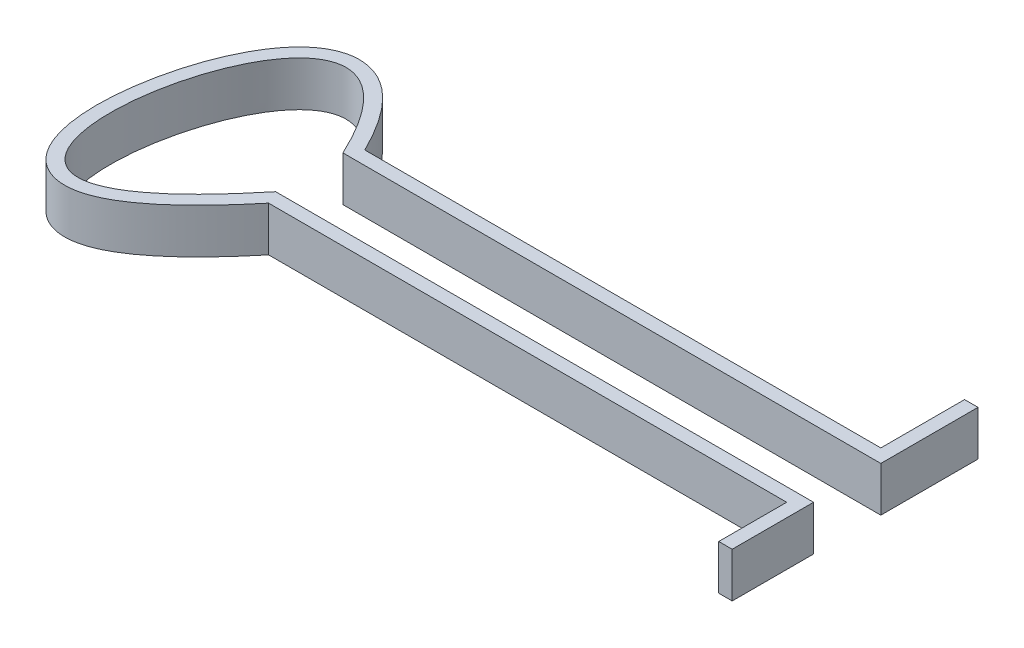
ISO-10303-21;
HEADER;
FILE_DESCRIPTION(('STEP AP214'),'2;1');
FILE_NAME('part.step','',(''),(''),'','','');
FILE_SCHEMA(('AUTOMOTIVE_DESIGN { 1 0 10303 214 1 1 1 1 }'));
ENDSEC;
DATA;
#1=APPLICATION_CONTEXT('core data for automotive mechanical design processes');
#2=APPLICATION_PROTOCOL_DEFINITION('international standard','automotive_design',2000,#1);
#3=PRODUCT_CONTEXT('',#1,'mechanical');
#4=PRODUCT('Part','Part','',(#3));
#5=PRODUCT_RELATED_PRODUCT_CATEGORY('part','',(#4));
#6=PRODUCT_DEFINITION_FORMATION('','',#4);
#7=PRODUCT_DEFINITION_CONTEXT('part definition',#1,'design');
#8=PRODUCT_DEFINITION('design','',#6,#7);
#9=PRODUCT_DEFINITION_SHAPE('','',#8);
#10=(LENGTH_UNIT() NAMED_UNIT(*) SI_UNIT(.MILLI.,.METRE.));
#11=(NAMED_UNIT(*) PLANE_ANGLE_UNIT() SI_UNIT($,.RADIAN.));
#12=(NAMED_UNIT(*) SI_UNIT($,.STERADIAN.) SOLID_ANGLE_UNIT());
#13=UNCERTAINTY_MEASURE_WITH_UNIT(LENGTH_MEASURE(1.E-05),#10,'distance_accuracy_value','');
#14=(GEOMETRIC_REPRESENTATION_CONTEXT(3) GLOBAL_UNCERTAINTY_ASSIGNED_CONTEXT((#13)) GLOBAL_UNIT_ASSIGNED_CONTEXT((#10,
#11,#12)) REPRESENTATION_CONTEXT('',''));
#15=CARTESIAN_POINT('',(0.,0.,0.));
#16=DIRECTION('',(0.,0.,1.));
#17=DIRECTION('',(1.,0.,0.));
#18=AXIS2_PLACEMENT_3D('',#15,#16,#17);
#19=CARTESIAN_POINT('',(12.,1.,0.75));
#20=DIRECTION('',(1.,0.,0.));
#21=DIRECTION('',(0.,0.,-1.));
#22=AXIS2_PLACEMENT_3D('',#19,#20,#21);
#23=PLANE('',#22);
#24=DIRECTION('',(0.,0.,1.));
#25=VECTOR('',#24,1.);
#26=CARTESIAN_POINT('',(12.,0.,0.75));
#27=LINE('',#26,#25);
#28=CARTESIAN_POINT('',(12.,0.,0.75));
#29=VERTEX_POINT('',#28);
#30=CARTESIAN_POINT('',(12.,0.,2.56575674506485));
#31=VERTEX_POINT('',#30);
#32=EDGE_CURVE('E344',#29,#31,#27,.T.);
#33=ORIENTED_EDGE('',*,*,#32,.F.);
#34=DIRECTION('',(0.,-1.,0.));
#35=VECTOR('',#34,1.);
#36=CARTESIAN_POINT('',(12.,1.,0.75));
#37=LINE('',#36,#35);
#38=CARTESIAN_POINT('',(12.,1.,0.75));
#39=VERTEX_POINT('',#38);
#40=EDGE_CURVE('E204',#39,#29,#37,.T.);
#41=ORIENTED_EDGE('',*,*,#40,.F.);
#42=DIRECTION('',(0.,0.,1.));
#43=VECTOR('',#42,1.);
#44=CARTESIAN_POINT('',(12.,1.,0.75));
#45=LINE('',#44,#43);
#46=CARTESIAN_POINT('',(12.,1.,2.56575674506485));
#47=VERTEX_POINT('',#46);
#48=EDGE_CURVE('E341',#39,#47,#45,.T.);
#49=ORIENTED_EDGE('',*,*,#48,.T.);
#50=DIRECTION('',(0.,-1.,0.));
#51=VECTOR('',#50,1.);
#52=CARTESIAN_POINT('',(12.,1.,2.56575674506485));
#53=LINE('',#52,#51);
#54=EDGE_CURVE('E224',#47,#31,#53,.T.);
#55=ORIENTED_EDGE('',*,*,#54,.T.);
#56=EDGE_LOOP('',(#33,#41,#49,#55));
#57=FACE_BOUND('',#56,.T.);
#58=ADVANCED_FACE('F127',(#57),#23,.T.);
#59=CARTESIAN_POINT('',(12.,1.,0.75));
#60=DIRECTION('',(0.,0.,-1.));
#61=DIRECTION('',(-1.,0.,0.));
#62=AXIS2_PLACEMENT_3D('',#59,#60,#61);
#63=PLANE('',#62);
#64=ORIENTED_EDGE('',*,*,#40,.T.);
#65=DIRECTION('',(1.,0.,0.));
#66=VECTOR('',#65,1.);
#67=CARTESIAN_POINT('',(12.,0.,0.75));
#68=LINE('',#67,#66);
#69=CARTESIAN_POINT('',(0.,0.,0.750000000000001));
#70=VERTEX_POINT('',#69);
#71=EDGE_CURVE('E372',#70,#29,#68,.T.);
#72=ORIENTED_EDGE('',*,*,#71,.F.);
#73=DIRECTION('',(0.,-1.,0.));
#74=VECTOR('',#73,1.);
#75=CARTESIAN_POINT('',(0.,1.,0.750000000000001));
#76=LINE('',#75,#74);
#77=CARTESIAN_POINT('',(0.,1.,0.750000000000001));
#78=VERTEX_POINT('',#77);
#79=EDGE_CURVE('E206',#78,#70,#76,.T.);
#80=ORIENTED_EDGE('',*,*,#79,.F.);
#81=DIRECTION('',(1.,0.,0.));
#82=VECTOR('',#81,1.);
#83=CARTESIAN_POINT('',(12.,1.,0.75));
#84=LINE('',#83,#82);
#85=EDGE_CURVE('E282',#78,#39,#84,.T.);
#86=ORIENTED_EDGE('',*,*,#85,.T.);
#87=EDGE_LOOP('',(#64,#72,#80,#86));
#88=FACE_BOUND('',#87,.T.);
#89=ADVANCED_FACE('F248',(#88),#63,.T.);
#90=CARTESIAN_POINT('',(12.,1.,-1.05));
#91=DIRECTION('',(1.,0.,0.));
#92=DIRECTION('',(0.,0.,-1.));
#93=AXIS2_PLACEMENT_3D('',#90,#91,#92);
#94=PLANE('',#93);
#95=DIRECTION('',(0.,0.,1.));
#96=VECTOR('',#95,1.);
#97=CARTESIAN_POINT('',(12.,0.,-1.05));
#98=LINE('',#97,#96);
#99=CARTESIAN_POINT('',(12.,0.,-2.91798327591554));
#100=VERTEX_POINT('',#99);
#101=CARTESIAN_POINT('',(12.,0.,-0.75));
#102=VERTEX_POINT('',#101);
#103=EDGE_CURVE('E174',#100,#102,#98,.T.);
#104=ORIENTED_EDGE('',*,*,#103,.F.);
#105=DIRECTION('',(0.,-1.,0.));
#106=VECTOR('',#105,1.);
#107=CARTESIAN_POINT('',(12.,1.,-2.91798327591554));
#108=LINE('',#107,#106);
#109=CARTESIAN_POINT('',(12.,1.,-2.91798327591554));
#110=VERTEX_POINT('',#109);
#111=EDGE_CURVE('E186',#110,#100,#108,.T.);
#112=ORIENTED_EDGE('',*,*,#111,.F.);
#113=DIRECTION('',(0.,0.,1.));
#114=VECTOR('',#113,1.);
#115=CARTESIAN_POINT('',(12.,1.,-1.05));
#116=LINE('',#115,#114);
#117=CARTESIAN_POINT('',(12.,1.,-0.75));
#118=VERTEX_POINT('',#117);
#119=EDGE_CURVE('E239',#110,#118,#116,.T.);
#120=ORIENTED_EDGE('',*,*,#119,.T.);
#121=DIRECTION('',(0.,-1.,0.));
#122=VECTOR('',#121,1.);
#123=CARTESIAN_POINT('',(12.,1.,-0.75));
#124=LINE('',#123,#122);
#125=EDGE_CURVE('E365',#118,#102,#124,.T.);
#126=ORIENTED_EDGE('',*,*,#125,.T.);
#127=EDGE_LOOP('',(#104,#112,#120,#126));
#128=FACE_BOUND('',#127,.T.);
#129=ADVANCED_FACE('F246',(#128),#94,.T.);
#130=CARTESIAN_POINT('',(-3.29763770808291,0.,0.195296987080229));
#131=DIRECTION('',(0.,-1.,0.));
#132=DIRECTION('',(-1.,0.,0.));
#133=AXIS2_PLACEMENT_3D('',#130,#131,#132);
#134=PLANE('',#133);
#135=DIRECTION('',(-1.,0.,0.));
#136=VECTOR('',#135,1.);
#137=CARTESIAN_POINT('',(12.,0.,-0.75));
#138=LINE('',#137,#136);
#139=CARTESIAN_POINT('',(0.,0.,-0.749999999999998));
#140=VERTEX_POINT('',#139);
#141=EDGE_CURVE('E369',#102,#140,#138,.T.);
#142=ORIENTED_EDGE('',*,*,#141,.T.);
#143=CARTESIAN_POINT('',(0.,0.,-0.749999999999998));
#144=CARTESIAN_POINT('',(-3.05460844596616,0.,-7.29435552246422));
#145=CARTESIAN_POINT('',(-5.7390921089216,0.,7.8151474880115));
#146=CARTESIAN_POINT('',(0.,0.,0.750000000000002));
#147=B_SPLINE_CURVE_WITH_KNOTS('',3,(#143,#144,#145,#146),.UNSPECIFIED.,.F.,.F.,(4,4),(0.,1.),.UNSPECIFIED.);
#148=EDGE_CURVE('E371',#140,#70,#147,.T.);
#149=ORIENTED_EDGE('',*,*,#148,.T.);
#150=ORIENTED_EDGE('',*,*,#71,.T.);
#151=ORIENTED_EDGE('',*,*,#32,.T.);
#152=DIRECTION('',(-1.,0.,0.));
#153=VECTOR('',#152,1.);
#154=CARTESIAN_POINT('',(12.,0.,2.56575674506485));
#155=LINE('',#154,#153);
#156=CARTESIAN_POINT('',(11.7,0.,2.56575674506485));
#157=VERTEX_POINT('',#156);
#158=EDGE_CURVE('E221',#31,#157,#155,.T.);
#159=ORIENTED_EDGE('',*,*,#158,.T.);
#160=DIRECTION('',(0.,0.,-1.));
#161=VECTOR('',#160,1.);
#162=CARTESIAN_POINT('',(11.7,0.,0.75));
#163=LINE('',#162,#161);
#164=CARTESIAN_POINT('',(11.7,0.,1.05));
#165=VERTEX_POINT('',#164);
#166=EDGE_CURVE('E203',#165,#157,#163,.F.);
#167=ORIENTED_EDGE('',*,*,#166,.F.);
#168=DIRECTION('',(1.,0.,0.));
#169=VECTOR('',#168,1.);
#170=CARTESIAN_POINT('',(12.,0.,1.05));
#171=LINE('',#170,#169);
#172=CARTESIAN_POINT('',(0.142017656530043,0.,1.04999999999997));
#173=VERTEX_POINT('',#172);
#174=EDGE_CURVE('E232',#173,#165,#171,.T.);
#175=ORIENTED_EDGE('',*,*,#174,.F.);
#176=CARTESIAN_POINT('',(0.188737475079369,0.,-1.05000000000077));
#177=CARTESIAN_POINT('',(-0.00623066673862435,0.,-1.44461604351487));
#178=CARTESIAN_POINT('',(-0.202103872039046,0.,-1.76167528713868));
#179=CARTESIAN_POINT('',(-0.60236215558205,0.,-2.26332472992038));
#180=CARTESIAN_POINT('',(-0.807283235955483,0.,-2.44915938356683));
#181=CARTESIAN_POINT('',(-1.24142046827214,0.,-2.69437696458514));
#182=CARTESIAN_POINT('',(-1.47399203384513,0.,-2.75025148541265));
#183=CARTESIAN_POINT('',(-1.92028355521816,0.,-2.71631693914565));
#184=CARTESIAN_POINT('',(-2.12691637498861,0.,-2.6293469032868));
#185=CARTESIAN_POINT('',(-2.48527279219832,0.,-2.37602083643426));
#186=CARTESIAN_POINT('',(-2.64064828562096,0.,-2.21007439700882));
#187=CARTESIAN_POINT('',(-2.91770848233255,0.,-1.8273598342353));
#188=CARTESIAN_POINT('',(-3.03935843837088,0.,-1.60982191209649));
#189=CARTESIAN_POINT('',(-3.35926486031367,0.,-0.905300073656018));
#190=CARTESIAN_POINT('',(-3.51276228452031,0.,-0.366014687713816));
#191=CARTESIAN_POINT('',(-3.68222369762933,0.,0.707176031667566));
#192=CARTESIAN_POINT('',(-3.69903125556612,0.,1.23962594320525));
#193=CARTESIAN_POINT('',(-3.5857844192635,0.,1.93485051873964));
#194=CARTESIAN_POINT('',(-3.52500054761445,0.,2.15006099245367));
#195=CARTESIAN_POINT('',(-3.33584078625393,0.,2.53241391109929));
#196=CARTESIAN_POINT('',(-3.20476320664506,0.,2.7022580715191));
#197=CARTESIAN_POINT('',(-2.93671411077461,0.,2.87860771400436));
#198=CARTESIAN_POINT('',(-2.8360854383937,0.,2.92322612199284));
#199=CARTESIAN_POINT('',(-2.62140154361181,0.,2.97605919707439));
#200=CARTESIAN_POINT('',(-2.5078645461521,0.,2.98435928446106));
#201=CARTESIAN_POINT('',(-2.16023093745061,0.,2.95752231485432));
#202=CARTESIAN_POINT('',(-1.92022991221463,0.,2.87347299463238));
#203=CARTESIAN_POINT('',(-1.40887574123493,0.,2.58509703873658));
#204=CARTESIAN_POINT('',(-1.13582602291264,0.,2.37936130223542));
#205=CARTESIAN_POINT('',(-0.537724241790539,0.,1.82660916978087));
#206=CARTESIAN_POINT('',(-0.212917804275779,0.,1.47926367418651));
#207=CARTESIAN_POINT('',(0.142017656530047,0.,1.04999999999997));
#208=B_SPLINE_CURVE_WITH_KNOTS('',3,(#176,#177,#178,#179,#180,#181,#182,#183,#184,#185,#186,
#187,#188,#189,#190,#191,#192,#193,#194,#195,#196,#197,#198,#199,#200,#201,#202,#203,#204,#205,
#206,#207),.UNSPECIFIED.,.F.,.F.,(4,2,2,2,2,2,2,2,2,2,2,2,2,2,2,4),(0.,0.0624999999999999,0.125,
0.1875,0.25,0.3125,0.375,0.5,0.625,0.6875,0.75,0.78125,0.8125,0.875,0.9375,1.),.UNSPECIFIED.);
#209=CARTESIAN_POINT('',(0.188737475079369,0.,-1.05000000000077));
#210=VERTEX_POINT('',#209);
#211=EDGE_CURVE('E348',#210,#173,#208,.T.);
#212=ORIENTED_EDGE('',*,*,#211,.F.);
#213=DIRECTION('',(-1.,0.,0.));
#214=VECTOR('',#213,1.);
#215=CARTESIAN_POINT('',(12.,0.,-1.05));
#216=LINE('',#215,#214);
#217=CARTESIAN_POINT('',(11.7,0.,-1.05));
#218=VERTEX_POINT('',#217);
#219=EDGE_CURVE('E196',#218,#210,#216,.T.);
#220=ORIENTED_EDGE('',*,*,#219,.F.);
#221=DIRECTION('',(0.,0.,-1.));
#222=VECTOR('',#221,1.);
#223=CARTESIAN_POINT('',(11.7,0.,-2.91798327591554));
#224=LINE('',#223,#222);
#225=CARTESIAN_POINT('',(11.7,0.,-2.91798327591554));
#226=VERTEX_POINT('',#225);
#227=EDGE_CURVE('E179',#226,#218,#224,.F.);
#228=ORIENTED_EDGE('',*,*,#227,.F.);
#229=DIRECTION('',(1.,0.,0.));
#230=VECTOR('',#229,1.);
#231=CARTESIAN_POINT('',(11.7,0.,-2.91798327591554));
#232=LINE('',#231,#230);
#233=EDGE_CURVE('E193',#226,#100,#232,.T.);
#234=ORIENTED_EDGE('',*,*,#233,.T.);
#235=ORIENTED_EDGE('',*,*,#103,.T.);
#236=EDGE_LOOP('',(#142,#149,#150,#151,#159,#167,#175,#212,#220,#228,#234,#235));
#237=FACE_BOUND('',#236,.T.);
#238=ADVANCED_FACE('F192',(#237),#134,.T.);
#239=CARTESIAN_POINT('',(-3.29763770808291,1.,0.195296987080229));
#240=DIRECTION('',(0.,-1.,0.));
#241=DIRECTION('',(-1.,0.,0.));
#242=AXIS2_PLACEMENT_3D('',#239,#240,#241);
#243=PLANE('',#242);
#244=ORIENTED_EDGE('',*,*,#119,.F.);
#245=DIRECTION('',(1.,0.,0.));
#246=VECTOR('',#245,1.);
#247=CARTESIAN_POINT('',(11.7,1.,-2.91798327591554));
#248=LINE('',#247,#246);
#249=CARTESIAN_POINT('',(11.7,1.,-2.91798327591554));
#250=VERTEX_POINT('',#249);
#251=EDGE_CURVE('E187',#250,#110,#248,.T.);
#252=ORIENTED_EDGE('',*,*,#251,.F.);
#253=DIRECTION('',(0.,0.,-1.));
#254=VECTOR('',#253,1.);
#255=CARTESIAN_POINT('',(11.7,1.,-2.91798327591554));
#256=LINE('',#255,#254);
#257=CARTESIAN_POINT('',(11.7,1.,-1.05));
#258=VERTEX_POINT('',#257);
#259=EDGE_CURVE('E181',#250,#258,#256,.F.);
#260=ORIENTED_EDGE('',*,*,#259,.T.);
#261=DIRECTION('',(-1.,0.,0.));
#262=VECTOR('',#261,1.);
#263=CARTESIAN_POINT('',(12.,1.,-1.05));
#264=LINE('',#263,#262);
#265=CARTESIAN_POINT('',(0.188737475079369,1.,-1.05000000000077));
#266=VERTEX_POINT('',#265);
#267=EDGE_CURVE('E244',#258,#266,#264,.T.);
#268=ORIENTED_EDGE('',*,*,#267,.T.);
#269=CARTESIAN_POINT('',(0.188737475079369,1.,-1.05000000000077));
#270=CARTESIAN_POINT('',(-0.00623066673862435,1.,-1.44461604351487));
#271=CARTESIAN_POINT('',(-0.202103872039046,1.,-1.76167528713868));
#272=CARTESIAN_POINT('',(-0.60236215558205,1.,-2.26332472992038));
#273=CARTESIAN_POINT('',(-0.807283235955483,1.,-2.44915938356683));
#274=CARTESIAN_POINT('',(-1.24142046827214,1.,-2.69437696458514));
#275=CARTESIAN_POINT('',(-1.47399203384513,1.,-2.75025148541265));
#276=CARTESIAN_POINT('',(-1.92028355521816,1.,-2.71631693914565));
#277=CARTESIAN_POINT('',(-2.12691637498861,1.,-2.6293469032868));
#278=CARTESIAN_POINT('',(-2.48527279219832,1.,-2.37602083643426));
#279=CARTESIAN_POINT('',(-2.64064828562096,1.,-2.21007439700882));
#280=CARTESIAN_POINT('',(-2.91770848233255,1.,-1.8273598342353));
#281=CARTESIAN_POINT('',(-3.03935843837088,1.,-1.60982191209649));
#282=CARTESIAN_POINT('',(-3.35926486031367,1.,-0.905300073656018));
#283=CARTESIAN_POINT('',(-3.51276228452031,1.,-0.366014687713816));
#284=CARTESIAN_POINT('',(-3.68222369762933,1.,0.707176031667566));
#285=CARTESIAN_POINT('',(-3.69903125556612,1.,1.23962594320525));
#286=CARTESIAN_POINT('',(-3.5857844192635,1.,1.93485051873964));
#287=CARTESIAN_POINT('',(-3.52500054761445,1.,2.15006099245367));
#288=CARTESIAN_POINT('',(-3.33584078625393,1.,2.53241391109929));
#289=CARTESIAN_POINT('',(-3.20476320664506,1.,2.7022580715191));
#290=CARTESIAN_POINT('',(-2.93671411077461,1.,2.87860771400436));
#291=CARTESIAN_POINT('',(-2.8360854383937,1.,2.92322612199284));
#292=CARTESIAN_POINT('',(-2.62140154361181,1.,2.97605919707439));
#293=CARTESIAN_POINT('',(-2.5078645461521,1.,2.98435928446106));
#294=CARTESIAN_POINT('',(-2.16023093745061,1.,2.95752231485432));
#295=CARTESIAN_POINT('',(-1.92022991221463,1.,2.87347299463238));
#296=CARTESIAN_POINT('',(-1.40887574123493,1.,2.58509703873658));
#297=CARTESIAN_POINT('',(-1.13582602291264,1.,2.37936130223542));
#298=CARTESIAN_POINT('',(-0.537724241790539,1.,1.82660916978087));
#299=CARTESIAN_POINT('',(-0.212917804275779,1.,1.47926367418651));
#300=CARTESIAN_POINT('',(0.142017656530047,1.,1.04999999999997));
#301=B_SPLINE_CURVE_WITH_KNOTS('',3,(#269,#270,#271,#272,#273,#274,#275,#276,#277,#278,#279,
#280,#281,#282,#283,#284,#285,#286,#287,#288,#289,#290,#291,#292,#293,#294,#295,#296,#297,#298,
#299,#300),.UNSPECIFIED.,.F.,.F.,(4,2,2,2,2,2,2,2,2,2,2,2,2,2,2,4),(0.,0.0624999999999999,0.125,
0.1875,0.25,0.3125,0.375,0.5,0.625,0.6875,0.75,0.78125,0.8125,0.875,0.9375,1.),.UNSPECIFIED.);
#302=CARTESIAN_POINT('',(0.142017656530043,1.,1.04999999999997));
#303=VERTEX_POINT('',#302);
#304=EDGE_CURVE('E289',#266,#303,#301,.T.);
#305=ORIENTED_EDGE('',*,*,#304,.T.);
#306=DIRECTION('',(1.,0.,0.));
#307=VECTOR('',#306,1.);
#308=CARTESIAN_POINT('',(12.,1.,1.05));
#309=LINE('',#308,#307);
#310=CARTESIAN_POINT('',(11.7,1.,1.05));
#311=VERTEX_POINT('',#310);
#312=EDGE_CURVE('E346',#303,#311,#309,.T.);
#313=ORIENTED_EDGE('',*,*,#312,.T.);
#314=DIRECTION('',(0.,0.,-1.));
#315=VECTOR('',#314,1.);
#316=CARTESIAN_POINT('',(11.7,1.,0.75));
#317=LINE('',#316,#315);
#318=CARTESIAN_POINT('',(11.7,1.,2.56575674506485));
#319=VERTEX_POINT('',#318);
#320=EDGE_CURVE('E218',#311,#319,#317,.F.);
#321=ORIENTED_EDGE('',*,*,#320,.T.);
#322=DIRECTION('',(-1.,0.,0.));
#323=VECTOR('',#322,1.);
#324=CARTESIAN_POINT('',(12.,1.,2.56575674506485));
#325=LINE('',#324,#323);
#326=EDGE_CURVE('E220',#47,#319,#325,.T.);
#327=ORIENTED_EDGE('',*,*,#326,.F.);
#328=ORIENTED_EDGE('',*,*,#48,.F.);
#329=ORIENTED_EDGE('',*,*,#85,.F.);
#330=CARTESIAN_POINT('',(0.,1.,-0.749999999999998));
#331=CARTESIAN_POINT('',(-3.05460844596616,1.,-7.29435552246422));
#332=CARTESIAN_POINT('',(-5.7390921089216,1.,7.8151474880115));
#333=CARTESIAN_POINT('',(0.,1.,0.750000000000002));
#334=B_SPLINE_CURVE_WITH_KNOTS('',3,(#330,#331,#332,#333),.UNSPECIFIED.,.F.,.F.,(4,4),(0.,1.),.UNSPECIFIED.);
#335=CARTESIAN_POINT('',(0.,1.,-0.749999999999998));
#336=VERTEX_POINT('',#335);
#337=EDGE_CURVE('E275',#336,#78,#334,.T.);
#338=ORIENTED_EDGE('',*,*,#337,.F.);
#339=DIRECTION('',(-1.,0.,0.));
#340=VECTOR('',#339,1.);
#341=CARTESIAN_POINT('',(12.,1.,-0.75));
#342=LINE('',#341,#340);
#343=EDGE_CURVE('E243',#118,#336,#342,.T.);
#344=ORIENTED_EDGE('',*,*,#343,.F.);
#345=EDGE_LOOP('',(#244,#252,#260,#268,#305,#313,#321,#327,#328,#329,#338,#344));
#346=FACE_BOUND('',#345,.T.);
#347=ADVANCED_FACE('F234',(#346),#243,.F.);
#348=DIRECTION('',(0.,-1.,0.));
#349=VECTOR('',#348,1.);
#350=SURFACE_OF_LINEAR_EXTRUSION('',#334,#349);
#351=ORIENTED_EDGE('',*,*,#148,.F.);
#352=DIRECTION('',(0.,-1.,0.));
#353=VECTOR('',#352,1.);
#354=CARTESIAN_POINT('',(0.,1.,-0.749999999999998));
#355=LINE('',#354,#353);
#356=EDGE_CURVE('E214',#336,#140,#355,.T.);
#357=ORIENTED_EDGE('',*,*,#356,.F.);
#358=ORIENTED_EDGE('',*,*,#337,.T.);
#359=ORIENTED_EDGE('',*,*,#79,.T.);
#360=EDGE_LOOP('',(#351,#357,#358,#359));
#361=FACE_BOUND('',#360,.T.);
#362=ADVANCED_FACE('F250',(#361),#350,.T.);
#363=CARTESIAN_POINT('',(12.,1.,-0.75));
#364=DIRECTION('',(0.,0.,1.));
#365=DIRECTION('',(1.,0.,0.));
#366=AXIS2_PLACEMENT_3D('',#363,#364,#365);
#367=PLANE('',#366);
#368=ORIENTED_EDGE('',*,*,#356,.T.);
#369=ORIENTED_EDGE('',*,*,#141,.F.);
#370=ORIENTED_EDGE('',*,*,#125,.F.);
#371=ORIENTED_EDGE('',*,*,#343,.T.);
#372=EDGE_LOOP('',(#368,#369,#370,#371));
#373=FACE_BOUND('',#372,.T.);
#374=ADVANCED_FACE('F261',(#373),#367,.T.);
#375=CARTESIAN_POINT('',(12.,1.,-1.05));
#376=DIRECTION('',(0.,0.,1.));
#377=DIRECTION('',(1.,0.,0.));
#378=AXIS2_PLACEMENT_3D('',#375,#376,#377);
#379=PLANE('',#378);
#380=DIRECTION('',(0.,1.,0.));
#381=VECTOR('',#380,1.);
#382=CARTESIAN_POINT('',(11.7,1.,-1.05));
#383=LINE('',#382,#381);
#384=EDGE_CURVE('E136',#218,#258,#383,.T.);
#385=ORIENTED_EDGE('',*,*,#384,.F.);
#386=ORIENTED_EDGE('',*,*,#219,.T.);
#387=DIRECTION('',(0.,-1.,0.));
#388=VECTOR('',#387,1.);
#389=CARTESIAN_POINT('',(0.188737475079369,1.,-1.05000000000077));
#390=LINE('',#389,#388);
#391=EDGE_CURVE('E363',#266,#210,#390,.T.);
#392=ORIENTED_EDGE('',*,*,#391,.F.);
#393=ORIENTED_EDGE('',*,*,#267,.F.);
#394=EDGE_LOOP('',(#385,#386,#392,#393));
#395=FACE_BOUND('',#394,.T.);
#396=ADVANCED_FACE('F268',(#395),#379,.F.);
#397=DIRECTION('',(0.,-1.,0.));
#398=VECTOR('',#397,1.);
#399=SURFACE_OF_LINEAR_EXTRUSION('',#301,#398);
#400=ORIENTED_EDGE('',*,*,#211,.T.);
#401=DIRECTION('',(0.,-1.,0.));
#402=VECTOR('',#401,1.);
#403=CARTESIAN_POINT('',(0.142017656530043,1.,1.04999999999997));
#404=LINE('',#403,#402);
#405=EDGE_CURVE('E295',#303,#173,#404,.T.);
#406=ORIENTED_EDGE('',*,*,#405,.F.);
#407=ORIENTED_EDGE('',*,*,#304,.F.);
#408=ORIENTED_EDGE('',*,*,#391,.T.);
#409=EDGE_LOOP('',(#400,#406,#407,#408));
#410=FACE_BOUND('',#409,.T.);
#411=ADVANCED_FACE('F301',(#410),#399,.F.);
#412=CARTESIAN_POINT('',(12.,1.,1.05));
#413=DIRECTION('',(0.,0.,-1.));
#414=DIRECTION('',(-1.,0.,0.));
#415=AXIS2_PLACEMENT_3D('',#412,#413,#414);
#416=PLANE('',#415);
#417=DIRECTION('',(0.,-1.,0.));
#418=VECTOR('',#417,1.);
#419=CARTESIAN_POINT('',(11.7,1.,1.05));
#420=LINE('',#419,#418);
#421=EDGE_CURVE('E12',#311,#165,#420,.T.);
#422=ORIENTED_EDGE('',*,*,#421,.F.);
#423=ORIENTED_EDGE('',*,*,#312,.F.);
#424=ORIENTED_EDGE('',*,*,#405,.T.);
#425=ORIENTED_EDGE('',*,*,#174,.T.);
#426=EDGE_LOOP('',(#422,#423,#424,#425));
#427=FACE_BOUND('',#426,.T.);
#428=ADVANCED_FACE('F303',(#427),#416,.F.);
#429=CARTESIAN_POINT('',(11.7,1.,-2.91798327591554));
#430=DIRECTION('',(0.,0.,-1.));
#431=DIRECTION('',(-1.,0.,0.));
#432=AXIS2_PLACEMENT_3D('',#429,#430,#431);
#433=PLANE('',#432);
#434=ORIENTED_EDGE('',*,*,#233,.F.);
#435=DIRECTION('',(0.,-1.,0.));
#436=VECTOR('',#435,1.);
#437=CARTESIAN_POINT('',(11.7,1.,-2.91798327591554));
#438=LINE('',#437,#436);
#439=EDGE_CURVE('E177',#250,#226,#438,.T.);
#440=ORIENTED_EDGE('',*,*,#439,.F.);
#441=ORIENTED_EDGE('',*,*,#251,.T.);
#442=ORIENTED_EDGE('',*,*,#111,.T.);
#443=EDGE_LOOP('',(#434,#440,#441,#442));
#444=FACE_BOUND('',#443,.T.);
#445=ADVANCED_FACE('F198',(#444),#433,.T.);
#446=CARTESIAN_POINT('',(11.7,1.,-2.91798327591554));
#447=DIRECTION('',(1.,0.,0.));
#448=DIRECTION('',(0.,0.,-1.));
#449=AXIS2_PLACEMENT_3D('',#446,#447,#448);
#450=PLANE('',#449);
#451=ORIENTED_EDGE('',*,*,#227,.T.);
#452=ORIENTED_EDGE('',*,*,#384,.T.);
#453=ORIENTED_EDGE('',*,*,#259,.F.);
#454=ORIENTED_EDGE('',*,*,#439,.T.);
#455=EDGE_LOOP('',(#451,#452,#453,#454));
#456=FACE_BOUND('',#455,.T.);
#457=ADVANCED_FACE('F129',(#456),#450,.F.);
#458=CARTESIAN_POINT('',(12.,1.,2.56575674506485));
#459=DIRECTION('',(0.,0.,1.));
#460=DIRECTION('',(1.,0.,0.));
#461=AXIS2_PLACEMENT_3D('',#458,#459,#460);
#462=PLANE('',#461);
#463=ORIENTED_EDGE('',*,*,#158,.F.);
#464=ORIENTED_EDGE('',*,*,#54,.F.);
#465=ORIENTED_EDGE('',*,*,#326,.T.);
#466=DIRECTION('',(0.,-1.,0.));
#467=VECTOR('',#466,1.);
#468=CARTESIAN_POINT('',(11.7,1.,2.56575674506485));
#469=LINE('',#468,#467);
#470=EDGE_CURVE('E230',#319,#157,#469,.T.);
#471=ORIENTED_EDGE('',*,*,#470,.T.);
#472=EDGE_LOOP('',(#463,#464,#465,#471));
#473=FACE_BOUND('',#472,.T.);
#474=ADVANCED_FACE('F257',(#473),#462,.T.);
#475=CARTESIAN_POINT('',(11.7,1.,0.75));
#476=DIRECTION('',(1.,0.,0.));
#477=DIRECTION('',(0.,0.,-1.));
#478=AXIS2_PLACEMENT_3D('',#475,#476,#477);
#479=PLANE('',#478);
#480=ORIENTED_EDGE('',*,*,#320,.F.);
#481=ORIENTED_EDGE('',*,*,#421,.T.);
#482=ORIENTED_EDGE('',*,*,#166,.T.);
#483=ORIENTED_EDGE('',*,*,#470,.F.);
#484=EDGE_LOOP('',(#480,#481,#482,#483));
#485=FACE_BOUND('',#484,.T.);
#486=ADVANCED_FACE('F271',(#485),#479,.F.);
#487=CLOSED_SHELL('',(#58,#89,#129,#238,#347,#362,#374,#396,#411,#428,#445,#457,#474,#486));
#488=MANIFOLD_SOLID_BREP('B2',#487);
#489=ADVANCED_BREP_SHAPE_REPRESENTATION('',(#18,#488),#14);
#490=SHAPE_DEFINITION_REPRESENTATION(#9,#489);
ENDSEC;
END-ISO-10303-21;
